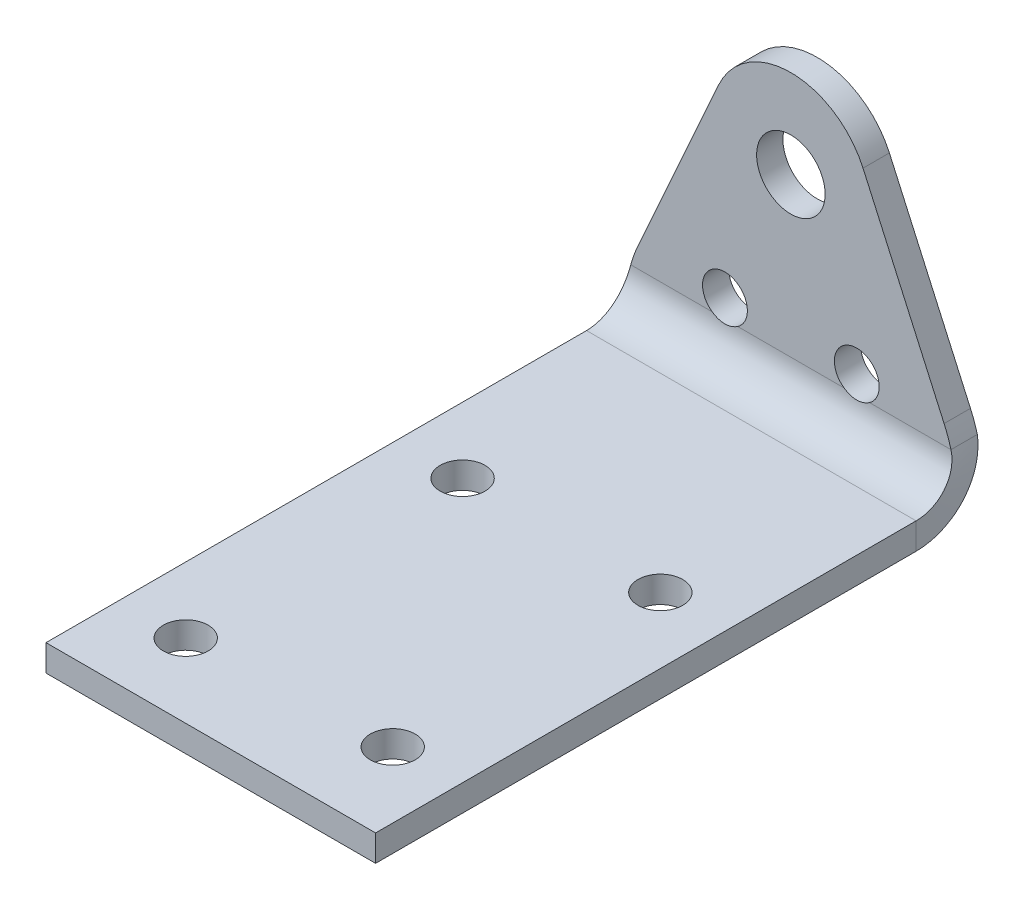
ISO-10303-21;
HEADER;
FILE_DESCRIPTION(('STEP AP214'),'2;1');
FILE_NAME('part.step','',(''),(''),'','','');
FILE_SCHEMA(('AUTOMOTIVE_DESIGN { 1 0 10303 214 1 1 1 1 }'));
ENDSEC;
DATA;
#1=APPLICATION_CONTEXT('core data for automotive mechanical design processes');
#2=APPLICATION_PROTOCOL_DEFINITION('international standard','automotive_design',2000,#1);
#3=PRODUCT_CONTEXT('',#1,'mechanical');
#4=PRODUCT('Part','Part','',(#3));
#5=PRODUCT_RELATED_PRODUCT_CATEGORY('part','',(#4));
#6=PRODUCT_DEFINITION_FORMATION('','',#4);
#7=PRODUCT_DEFINITION_CONTEXT('part definition',#1,'design');
#8=PRODUCT_DEFINITION('design','',#6,#7);
#9=PRODUCT_DEFINITION_SHAPE('','',#8);
#10=(LENGTH_UNIT() NAMED_UNIT(*) SI_UNIT(.MILLI.,.METRE.));
#11=(NAMED_UNIT(*) PLANE_ANGLE_UNIT() SI_UNIT($,.RADIAN.));
#12=(NAMED_UNIT(*) SI_UNIT($,.STERADIAN.) SOLID_ANGLE_UNIT());
#13=UNCERTAINTY_MEASURE_WITH_UNIT(LENGTH_MEASURE(1.E-05),#10,'distance_accuracy_value','');
#14=(GEOMETRIC_REPRESENTATION_CONTEXT(3) GLOBAL_UNCERTAINTY_ASSIGNED_CONTEXT((#13)) GLOBAL_UNIT_ASSIGNED_CONTEXT((#10,
#11,#12)) REPRESENTATION_CONTEXT('',''));
#15=CARTESIAN_POINT('',(0.,0.,0.));
#16=DIRECTION('',(0.,0.,1.));
#17=DIRECTION('',(1.,0.,0.));
#18=AXIS2_PLACEMENT_3D('',#15,#16,#17);
#19=CARTESIAN_POINT('',(2.5,2.35907516703581,-44.));
#20=DIRECTION('',(0.,0.,1.));
#21=DIRECTION('',(1.,0.,0.));
#22=AXIS2_PLACEMENT_3D('',#19,#20,#21);
#23=CYLINDRICAL_SURFACE('',#22,10.);
#24=CARTESIAN_POINT('',(12.1449736146157,5.,-46.));
#25=CARTESIAN_POINT('',(12.1449736146157,5.,-44.));
#26=B_SPLINE_CURVE_WITH_KNOTS('',1,(#24,#25),.UNSPECIFIED.,.F.,.F.,(2,2),(0.,1.),.UNSPECIFIED.);
#27=CARTESIAN_POINT('',(12.1449736146157,5.,-46.));
#28=VERTEX_POINT('',#27);
#29=CARTESIAN_POINT('',(12.1449736146157,5.,-44.));
#30=VERTEX_POINT('',#29);
#31=EDGE_CURVE('E403',#28,#30,#26,.T.);
#32=ORIENTED_EDGE('',*,*,#31,.F.);
#33=CARTESIAN_POINT('',(2.5,2.35907516703581,-46.));
#34=DIRECTION('',(0.,0.,1.));
#35=DIRECTION('',(1.,0.,0.));
#36=AXIS2_PLACEMENT_3D('',#33,#34,#35);
#37=CIRCLE('',#36,10.);
#38=CARTESIAN_POINT('',(11.6234646864046,6.45326521097956,-46.));
#39=VERTEX_POINT('',#38);
#40=EDGE_CURVE('E289',#28,#39,#37,.T.);
#41=ORIENTED_EDGE('',*,*,#40,.T.);
#42=DIRECTION('',(0.,0.,1.));
#43=VECTOR('',#42,1.);
#44=CARTESIAN_POINT('',(11.6234646864046,6.45326521097956,-44.));
#45=LINE('',#44,#43);
#46=CARTESIAN_POINT('',(11.6234646864046,6.45326521097956,-44.));
#47=VERTEX_POINT('',#46);
#48=EDGE_CURVE('E401',#39,#47,#45,.T.);
#49=ORIENTED_EDGE('',*,*,#48,.T.);
#50=CARTESIAN_POINT('',(2.5,2.35907516703581,-44.));
#51=DIRECTION('',(0.,0.,1.));
#52=DIRECTION('',(-1.,0.,0.));
#53=AXIS2_PLACEMENT_3D('',#50,#51,#52);
#54=CIRCLE('',#53,10.);
#55=EDGE_CURVE('E265',#30,#47,#54,.T.);
#56=ORIENTED_EDGE('',*,*,#55,.F.);
#57=EDGE_LOOP('',(#32,#41,#49,#56));
#58=FACE_BOUND('',#57,.T.);
#59=ADVANCED_FACE('F37',(#58),#23,.T.);
#60=CARTESIAN_POINT('',(5.47407881184279,20.1565140263662,-44.));
#61=DIRECTION('',(-0.912346468640461,-0.409419004394374,0.));
#62=DIRECTION('',(-0.409419004394374,0.912346468640461,0.));
#63=AXIS2_PLACEMENT_3D('',#60,#61,#62);
#64=PLANE('',#63);
#65=ORIENTED_EDGE('',*,*,#48,.F.);
#66=DIRECTION('',(-0.409419004394374,0.912346468640461,0.));
#67=VECTOR('',#66,1.);
#68=CARTESIAN_POINT('',(5.47407881184279,20.1565140263662,-46.));
#69=LINE('',#68,#67);
#70=CARTESIAN_POINT('',(5.47407881184279,20.1565140263662,-46.));
#71=VERTEX_POINT('',#70);
#72=EDGE_CURVE('E286',#39,#71,#69,.T.);
#73=ORIENTED_EDGE('',*,*,#72,.T.);
#74=DIRECTION('',(0.,0.,1.));
#75=VECTOR('',#74,1.);
#76=CARTESIAN_POINT('',(5.47407881184279,20.1565140263662,-44.));
#77=LINE('',#76,#75);
#78=CARTESIAN_POINT('',(5.47407881184279,20.1565140263662,-44.));
#79=VERTEX_POINT('',#78);
#80=EDGE_CURVE('E399',#71,#79,#77,.T.);
#81=ORIENTED_EDGE('',*,*,#80,.T.);
#82=DIRECTION('',(-0.409419004394374,0.912346468640461,0.));
#83=VECTOR('',#82,1.);
#84=CARTESIAN_POINT('',(5.47407881184279,20.1565140263662,-44.));
#85=LINE('',#84,#83);
#86=EDGE_CURVE('E261',#47,#79,#85,.T.);
#87=ORIENTED_EDGE('',*,*,#86,.F.);
#88=EDGE_LOOP('',(#65,#73,#81,#87));
#89=FACE_BOUND('',#88,.T.);
#90=ADVANCED_FACE('F435',(#89),#64,.F.);
#91=CARTESIAN_POINT('',(0.,17.7,-44.));
#92=DIRECTION('',(0.,0.,1.));
#93=DIRECTION('',(1.,0.,0.));
#94=AXIS2_PLACEMENT_3D('',#91,#92,#93);
#95=CYLINDRICAL_SURFACE('',#94,6.);
#96=ORIENTED_EDGE('',*,*,#80,.F.);
#97=CARTESIAN_POINT('',(0.,17.7,-46.));
#98=DIRECTION('',(0.,0.,1.));
#99=DIRECTION('',(1.,0.,0.));
#100=AXIS2_PLACEMENT_3D('',#97,#98,#99);
#101=CIRCLE('',#100,6.);
#102=CARTESIAN_POINT('',(-5.47407881184273,20.1565140263663,-46.));
#103=VERTEX_POINT('',#102);
#104=EDGE_CURVE('E283',#71,#103,#101,.T.);
#105=ORIENTED_EDGE('',*,*,#104,.T.);
#106=DIRECTION('',(0.,0.,1.));
#107=VECTOR('',#106,1.);
#108=CARTESIAN_POINT('',(-5.47407881184273,20.1565140263663,-44.));
#109=LINE('',#108,#107);
#110=CARTESIAN_POINT('',(-5.47407881184273,20.1565140263663,-44.));
#111=VERTEX_POINT('',#110);
#112=EDGE_CURVE('E397',#103,#111,#109,.T.);
#113=ORIENTED_EDGE('',*,*,#112,.T.);
#114=CARTESIAN_POINT('',(0.,17.7,-44.));
#115=DIRECTION('',(0.,0.,1.));
#116=DIRECTION('',(-1.,0.,0.));
#117=AXIS2_PLACEMENT_3D('',#114,#115,#116);
#118=CIRCLE('',#117,6.);
#119=EDGE_CURVE('E264',#79,#111,#118,.T.);
#120=ORIENTED_EDGE('',*,*,#119,.F.);
#121=EDGE_LOOP('',(#96,#105,#113,#120));
#122=FACE_BOUND('',#121,.T.);
#123=ADVANCED_FACE('F438',(#122),#95,.T.);
#124=CARTESIAN_POINT('',(-11.6234646864046,6.45326521097959,-44.));
#125=DIRECTION('',(0.912346468640459,-0.409419004394377,0.));
#126=DIRECTION('',(-0.409419004394378,-0.91234646864046,0.));
#127=AXIS2_PLACEMENT_3D('',#124,#125,#126);
#128=PLANE('',#127);
#129=ORIENTED_EDGE('',*,*,#112,.F.);
#130=DIRECTION('',(-0.409419004394378,-0.91234646864046,0.));
#131=VECTOR('',#130,1.);
#132=CARTESIAN_POINT('',(-11.6234646864046,6.45326521097959,-46.));
#133=LINE('',#132,#131);
#134=CARTESIAN_POINT('',(-11.6234646864046,6.45326521097959,-46.));
#135=VERTEX_POINT('',#134);
#136=EDGE_CURVE('E280',#103,#135,#133,.T.);
#137=ORIENTED_EDGE('',*,*,#136,.T.);
#138=DIRECTION('',(0.,0.,1.));
#139=VECTOR('',#138,1.);
#140=CARTESIAN_POINT('',(-11.6234646864046,6.45326521097959,-44.));
#141=LINE('',#140,#139);
#142=CARTESIAN_POINT('',(-11.6234646864046,6.45326521097959,-44.));
#143=VERTEX_POINT('',#142);
#144=EDGE_CURVE('E390',#135,#143,#141,.T.);
#145=ORIENTED_EDGE('',*,*,#144,.T.);
#146=DIRECTION('',(-0.409419004394378,-0.91234646864046,0.));
#147=VECTOR('',#146,1.);
#148=CARTESIAN_POINT('',(-11.6234646864046,6.45326521097959,-44.));
#149=LINE('',#148,#147);
#150=EDGE_CURVE('E268',#111,#143,#149,.T.);
#151=ORIENTED_EDGE('',*,*,#150,.F.);
#152=EDGE_LOOP('',(#129,#137,#145,#151));
#153=FACE_BOUND('',#152,.T.);
#154=ADVANCED_FACE('F441',(#153),#128,.F.);
#155=CARTESIAN_POINT('',(-2.50000000000001,2.35907516703581,-44.));
#156=DIRECTION('',(0.,0.,1.));
#157=DIRECTION('',(1.,0.,0.));
#158=AXIS2_PLACEMENT_3D('',#155,#156,#157);
#159=CYLINDRICAL_SURFACE('',#158,10.);
#160=ORIENTED_EDGE('',*,*,#144,.F.);
#161=CARTESIAN_POINT('',(-2.50000000000001,2.35907516703581,-46.));
#162=DIRECTION('',(0.,0.,1.));
#163=DIRECTION('',(1.,0.,0.));
#164=AXIS2_PLACEMENT_3D('',#161,#162,#163);
#165=CIRCLE('',#164,10.);
#166=CARTESIAN_POINT('',(-12.1449736146157,5.,-46.));
#167=VERTEX_POINT('',#166);
#168=EDGE_CURVE('E176',#135,#167,#165,.T.);
#169=ORIENTED_EDGE('',*,*,#168,.T.);
#170=CARTESIAN_POINT('',(-12.1449736146157,5.,-44.));
#171=CARTESIAN_POINT('',(-12.1449736146157,5.,-46.));
#172=B_SPLINE_CURVE_WITH_KNOTS('',1,(#170,#171),.UNSPECIFIED.,.F.,.F.,(2,2),(0.,1.),.UNSPECIFIED.);
#173=CARTESIAN_POINT('',(-12.1449736146157,5.,-44.));
#174=VERTEX_POINT('',#173);
#175=EDGE_CURVE('E319',#167,#174,#172,.F.);
#176=ORIENTED_EDGE('',*,*,#175,.T.);
#177=CARTESIAN_POINT('',(-2.50000000000001,2.35907516703581,-44.));
#178=DIRECTION('',(0.,0.,1.));
#179=DIRECTION('',(-1.,0.,0.));
#180=AXIS2_PLACEMENT_3D('',#177,#178,#179);
#181=CIRCLE('',#180,10.);
#182=EDGE_CURVE('E459',#143,#174,#181,.T.);
#183=ORIENTED_EDGE('',*,*,#182,.F.);
#184=EDGE_LOOP('',(#160,#169,#176,#183));
#185=FACE_BOUND('',#184,.T.);
#186=ADVANCED_FACE('F344',(#185),#159,.T.);
#187=CARTESIAN_POINT('',(-12.5,0.,-41.));
#188=CARTESIAN_POINT('',(-12.5,0.,-41.590586073631));
#189=CARTESIAN_POINT('',(-12.5012351343653,0.109590480056256,-42.2374966227885));
#190=CARTESIAN_POINT('',(-12.4952300803929,0.482572011709241,-43.1690366897887));
#191=CARTESIAN_POINT('',(-12.4919187698153,0.640733939419891,-43.4728143055767));
#192=CARTESIAN_POINT('',(-12.4810584873086,1.01989145069746,-44.0457752892423));
#193=CARTESIAN_POINT('',(-12.4735095153795,1.24084319388301,-44.3148495161906));
#194=CARTESIAN_POINT('',(-12.4525555006583,1.73276233958689,-44.8006111716858));
#195=CARTESIAN_POINT('',(-12.4391504578663,2.00364122258677,-45.0172190879023));
#196=CARTESIAN_POINT('',(-12.4048658919077,2.57662885241432,-45.3867399517451));
#197=CARTESIAN_POINT('',(-12.3839863687413,2.87862591999868,-45.5396216201994));
#198=CARTESIAN_POINT('',(-12.3077084644133,3.79897644659601,-45.8980722934336));
#199=CARTESIAN_POINT('',(-12.2385358784326,4.43049902154608,-46.));
#200=CARTESIAN_POINT('',(-12.1449736146157,5.,-46.));
#201=CARTESIAN_POINT('',(-12.5,2.,-41.));
#202=CARTESIAN_POINT('',(-12.5,2.,-41.3543516441786));
#203=CARTESIAN_POINT('',(-12.5012351343653,2.06575428803375,-41.7424979736731));
#204=CARTESIAN_POINT('',(-12.4952300803929,2.28954320702554,-42.3014220138732));
#205=CARTESIAN_POINT('',(-12.4919187698153,2.38444036365193,-42.483688583346));
#206=CARTESIAN_POINT('',(-12.4810584873086,2.61193487041848,-42.8274651735454));
#207=CARTESIAN_POINT('',(-12.4735095153795,2.7445059163298,-42.9889097097144));
#208=CARTESIAN_POINT('',(-12.4525555006583,3.03965740375213,-43.2803667030115));
#209=CARTESIAN_POINT('',(-12.4391504578663,3.20218473355206,-43.4103314527414));
#210=CARTESIAN_POINT('',(-12.4048658919077,3.54597731144859,-43.6320439710471));
#211=CARTESIAN_POINT('',(-12.3839863687413,3.72717555199921,-43.7237729721196));
#212=CARTESIAN_POINT('',(-12.3077084644133,4.2793858679576,-43.9388433760602));
#213=CARTESIAN_POINT('',(-12.2385418985836,4.65827742661573,-44.));
#214=CARTESIAN_POINT('',(-12.1449736146157,5.,-44.));
#215=B_SPLINE_SURFACE_WITH_KNOTS('',1,3,((#187,#188,#189,#190,#191,#192,#193,#194,#195,#196,
#197,#198,#199,#200),(#201,#202,#203,#204,#205,#206,#207,#208,#209,#210,#211,#212,#213,#214)),
.UNSPECIFIED.,.F.,.F.,.F.,(2,2),(4,2,2,2,2,2,4),(0.,1.),(0.,0.25,0.375,0.5,0.625,0.75,1.),.UNSPECIFIED.);
#216=CARTESIAN_POINT('',(-12.1449736146157,5.,-46.));
#217=CARTESIAN_POINT('',(-12.2385358784326,4.43049902154608,-46.));
#218=CARTESIAN_POINT('',(-12.3077084644133,3.79897644659601,-45.8980722934336));
#219=CARTESIAN_POINT('',(-12.3839863687413,2.87862591999868,-45.5396216201994));
#220=CARTESIAN_POINT('',(-12.4048658919077,2.57662885241432,-45.3867399517451));
#221=CARTESIAN_POINT('',(-12.4391504578663,2.00364122258677,-45.0172190879023));
#222=CARTESIAN_POINT('',(-12.4525555006583,1.73276233958689,-44.8006111716858));
#223=CARTESIAN_POINT('',(-12.4735095153795,1.24084319388301,-44.3148495161906));
#224=CARTESIAN_POINT('',(-12.4810584873086,1.01989145069746,-44.0457752892423));
#225=CARTESIAN_POINT('',(-12.4919187698153,0.640733939419891,-43.4728143055767));
#226=CARTESIAN_POINT('',(-12.4952300803929,0.482572011709241,-43.1690366897887));
#227=CARTESIAN_POINT('',(-12.5012351343653,0.109590480056256,-42.2374966227885));
#228=CARTESIAN_POINT('',(-12.5,0.,-41.590586073631));
#229=CARTESIAN_POINT('',(-12.5,0.,-41.));
#230=B_SPLINE_CURVE_WITH_KNOTS('',3,(#216,#217,#218,#219,#220,#221,#222,#223,#224,#225,#226,
#227,#228,#229),.UNSPECIFIED.,.F.,.F.,(4,2,2,2,2,2,4),(0.,0.25,0.375,0.5,0.625,0.75,1.),.UNSPECIFIED.);
#231=CARTESIAN_POINT('',(-12.5,0.,-41.));
#232=VERTEX_POINT('',#231);
#233=EDGE_CURVE('E313',#167,#232,#230,.T.);
#234=CARTESIAN_POINT('',(-12.5,0.,-41.));
#235=CARTESIAN_POINT('',(-12.5,2.,-41.));
#236=B_SPLINE_CURVE_WITH_KNOTS('',1,(#234,#235),.UNSPECIFIED.,.F.,.F.,(2,2),(0.,1.),.UNSPECIFIED.);
#237=CARTESIAN_POINT('',(-12.5,2.,-41.));
#238=VERTEX_POINT('',#237);
#239=EDGE_CURVE('E303',#232,#238,#236,.T.);
#240=CARTESIAN_POINT('',(-12.5,2.,-41.));
#241=CARTESIAN_POINT('',(-12.5,2.,-41.3543516441786));
#242=CARTESIAN_POINT('',(-12.5012351343653,2.06575428803375,-41.7424979736731));
#243=CARTESIAN_POINT('',(-12.4952300803929,2.28954320702554,-42.3014220138732));
#244=CARTESIAN_POINT('',(-12.4919187698153,2.38444036365193,-42.483688583346));
#245=CARTESIAN_POINT('',(-12.4810584873086,2.61193487041848,-42.8274651735454));
#246=CARTESIAN_POINT('',(-12.4735095153795,2.7445059163298,-42.9889097097144));
#247=CARTESIAN_POINT('',(-12.4525555006583,3.03965740375213,-43.2803667030115));
#248=CARTESIAN_POINT('',(-12.4391504578663,3.20218473355206,-43.4103314527414));
#249=CARTESIAN_POINT('',(-12.4048658919077,3.54597731144859,-43.6320439710471));
#250=CARTESIAN_POINT('',(-12.3839863687413,3.72717555199921,-43.7237729721196));
#251=CARTESIAN_POINT('',(-12.3077084644133,4.2793858679576,-43.9388433760602));
#252=CARTESIAN_POINT('',(-12.2385418985836,4.65827742661573,-44.));
#253=CARTESIAN_POINT('',(-12.1449736146157,5.,-44.));
#254=B_SPLINE_CURVE_WITH_KNOTS('',3,(#240,#241,#242,#243,#244,#245,#246,#247,#248,#249,#250,
#251,#252,#253),.UNSPECIFIED.,.F.,.F.,(4,2,2,2,2,2,4),(0.,0.25,0.375,0.5,0.625,0.75,1.),.UNSPECIFIED.);
#255=EDGE_CURVE('E460',#174,#238,#254,.F.);
#256=ORIENTED_EDGE('',*,*,#175,.F.);
#257=ORIENTED_EDGE('',*,*,#233,.T.);
#258=ORIENTED_EDGE('',*,*,#239,.T.);
#259=ORIENTED_EDGE('',*,*,#255,.F.);
#260=EDGE_LOOP('',(#256,#257,#258,#259));
#261=FACE_BOUND('',#260,.T.);
#262=ADVANCED_FACE('F315',(#261),#215,.T.);
#263=CARTESIAN_POINT('',(-12.5,2.,-46.));
#264=DIRECTION('',(-1.,0.,0.));
#265=DIRECTION('',(0.,0.,1.));
#266=AXIS2_PLACEMENT_3D('',#263,#264,#265);
#267=PLANE('',#266);
#268=ORIENTED_EDGE('',*,*,#239,.F.);
#269=DIRECTION('',(0.,0.,1.));
#270=VECTOR('',#269,1.);
#271=CARTESIAN_POINT('',(-12.5,0.,0.));
#272=LINE('',#271,#270);
#273=CARTESIAN_POINT('',(-12.5,0.,0.));
#274=VERTEX_POINT('',#273);
#275=EDGE_CURVE('E279',#232,#274,#272,.T.);
#276=ORIENTED_EDGE('',*,*,#275,.T.);
#277=DIRECTION('',(0.,1.,0.));
#278=VECTOR('',#277,1.);
#279=CARTESIAN_POINT('',(-12.5,2.,0.));
#280=LINE('',#279,#278);
#281=CARTESIAN_POINT('',(-12.5,2.,0.));
#282=VERTEX_POINT('',#281);
#283=EDGE_CURVE('E301',#274,#282,#280,.T.);
#284=ORIENTED_EDGE('',*,*,#283,.T.);
#285=DIRECTION('',(0.,0.,1.));
#286=VECTOR('',#285,1.);
#287=CARTESIAN_POINT('',(-12.5,2.,-46.));
#288=LINE('',#287,#286);
#289=EDGE_CURVE('E271',#238,#282,#288,.T.);
#290=ORIENTED_EDGE('',*,*,#289,.F.);
#291=EDGE_LOOP('',(#268,#276,#284,#290));
#292=FACE_BOUND('',#291,.T.);
#293=ADVANCED_FACE('F299',(#292),#267,.T.);
#294=CARTESIAN_POINT('',(-12.5,2.,0.));
#295=DIRECTION('',(0.,0.,1.));
#296=DIRECTION('',(1.,0.,0.));
#297=AXIS2_PLACEMENT_3D('',#294,#295,#296);
#298=PLANE('',#297);
#299=ORIENTED_EDGE('',*,*,#283,.F.);
#300=DIRECTION('',(1.,0.,0.));
#301=VECTOR('',#300,1.);
#302=CARTESIAN_POINT('',(0.,0.,0.));
#303=LINE('',#302,#301);
#304=CARTESIAN_POINT('',(12.5,0.,0.));
#305=VERTEX_POINT('',#304);
#306=EDGE_CURVE('E276',#274,#305,#303,.T.);
#307=ORIENTED_EDGE('',*,*,#306,.T.);
#308=DIRECTION('',(0.,1.,0.));
#309=VECTOR('',#308,1.);
#310=CARTESIAN_POINT('',(12.5,2.,0.));
#311=LINE('',#310,#309);
#312=CARTESIAN_POINT('',(12.5,2.,0.));
#313=VERTEX_POINT('',#312);
#314=EDGE_CURVE('E497',#305,#313,#311,.T.);
#315=ORIENTED_EDGE('',*,*,#314,.T.);
#316=DIRECTION('',(1.,0.,0.));
#317=VECTOR('',#316,1.);
#318=CARTESIAN_POINT('',(-12.5,2.,0.));
#319=LINE('',#318,#317);
#320=EDGE_CURVE('E272',#282,#313,#319,.T.);
#321=ORIENTED_EDGE('',*,*,#320,.F.);
#322=EDGE_LOOP('',(#299,#307,#315,#321));
#323=FACE_BOUND('',#322,.T.);
#324=ADVANCED_FACE('F533',(#323),#298,.T.);
#325=CARTESIAN_POINT('',(12.5,2.,-46.));
#326=DIRECTION('',(1.,0.,0.));
#327=DIRECTION('',(0.,0.,-1.));
#328=AXIS2_PLACEMENT_3D('',#325,#326,#327);
#329=PLANE('',#328);
#330=ORIENTED_EDGE('',*,*,#314,.F.);
#331=DIRECTION('',(0.,0.,1.));
#332=VECTOR('',#331,1.);
#333=CARTESIAN_POINT('',(12.5,0.,0.));
#334=LINE('',#333,#332);
#335=CARTESIAN_POINT('',(12.5,0.,-41.));
#336=VERTEX_POINT('',#335);
#337=EDGE_CURVE('E160',#305,#336,#334,.F.);
#338=ORIENTED_EDGE('',*,*,#337,.T.);
#339=CARTESIAN_POINT('',(12.5,2.,-41.));
#340=CARTESIAN_POINT('',(12.5,0.,-41.));
#341=B_SPLINE_CURVE_WITH_KNOTS('',1,(#339,#340),.UNSPECIFIED.,.F.,.F.,(2,2),(0.,1.),.UNSPECIFIED.);
#342=CARTESIAN_POINT('',(12.5,2.,-41.));
#343=VERTEX_POINT('',#342);
#344=EDGE_CURVE('E503',#336,#343,#341,.F.);
#345=ORIENTED_EDGE('',*,*,#344,.T.);
#346=DIRECTION('',(0.,0.,-1.));
#347=VECTOR('',#346,1.);
#348=CARTESIAN_POINT('',(12.5,2.,-46.));
#349=LINE('',#348,#347);
#350=EDGE_CURVE('E275',#313,#343,#349,.T.);
#351=ORIENTED_EDGE('',*,*,#350,.F.);
#352=EDGE_LOOP('',(#330,#338,#345,#351));
#353=FACE_BOUND('',#352,.T.);
#354=ADVANCED_FACE('F534',(#353),#329,.T.);
#355=CARTESIAN_POINT('',(12.1449736146157,5.,-46.));
#356=CARTESIAN_POINT('',(12.2385358784326,4.43049902154608,-46.));
#357=CARTESIAN_POINT('',(12.3077084644133,3.798976446596,-45.8980722934336));
#358=CARTESIAN_POINT('',(12.3839863687413,2.87862591999867,-45.5396216201994));
#359=CARTESIAN_POINT('',(12.4048658919077,2.57662885241432,-45.3867399517451));
#360=CARTESIAN_POINT('',(12.4391504578663,2.00364122258677,-45.0172190879023));
#361=CARTESIAN_POINT('',(12.4525555006583,1.73276233958689,-44.8006111716858));
#362=CARTESIAN_POINT('',(12.4735095153795,1.24084319388301,-44.3148495161906));
#363=CARTESIAN_POINT('',(12.4810584873086,1.01989145069746,-44.0457752892423));
#364=CARTESIAN_POINT('',(12.4919187698153,0.64073393941989,-43.4728143055767));
#365=CARTESIAN_POINT('',(12.4952300803929,0.482572011709241,-43.1690366897887));
#366=CARTESIAN_POINT('',(12.5012351343653,0.109590480056256,-42.2374966227885));
#367=CARTESIAN_POINT('',(12.5,0.,-41.5905860736311));
#368=CARTESIAN_POINT('',(12.5,0.,-41.));
#369=CARTESIAN_POINT('',(12.1449736146157,5.,-44.));
#370=CARTESIAN_POINT('',(12.2385418985836,4.65827742661573,-44.));
#371=CARTESIAN_POINT('',(12.3077084644133,4.2793858679576,-43.9388433760602));
#372=CARTESIAN_POINT('',(12.3839863687413,3.7271755519992,-43.7237729721196));
#373=CARTESIAN_POINT('',(12.4048658919077,3.54597731144859,-43.6320439710471));
#374=CARTESIAN_POINT('',(12.4391504578663,3.20218473355206,-43.4103314527414));
#375=CARTESIAN_POINT('',(12.4525555006583,3.03965740375213,-43.2803667030115));
#376=CARTESIAN_POINT('',(12.4735095153795,2.7445059163298,-42.9889097097144));
#377=CARTESIAN_POINT('',(12.4810584873086,2.61193487041848,-42.8274651735454));
#378=CARTESIAN_POINT('',(12.4919187698153,2.38444036365193,-42.483688583346));
#379=CARTESIAN_POINT('',(12.4952300803929,2.28954320702554,-42.3014220138732));
#380=CARTESIAN_POINT('',(12.5012351343653,2.06575428803375,-41.7424979736731));
#381=CARTESIAN_POINT('',(12.5,2.,-41.3543516441786));
#382=CARTESIAN_POINT('',(12.5,2.,-41.));
#383=B_SPLINE_SURFACE_WITH_KNOTS('',1,3,((#355,#356,#357,#358,#359,#360,#361,#362,#363,#364,
#365,#366,#367,#368),(#369,#370,#371,#372,#373,#374,#375,#376,#377,#378,#379,#380,#381,#382)),
.UNSPECIFIED.,.F.,.F.,.F.,(2,2),(4,2,2,2,2,2,4),(0.,1.),(0.,0.25,0.375,0.5,0.625,0.75,1.),.UNSPECIFIED.);
#384=CARTESIAN_POINT('',(12.5,0.,-41.));
#385=CARTESIAN_POINT('',(12.5,0.,-41.5905860736311));
#386=CARTESIAN_POINT('',(12.5012351343653,0.109590480056256,-42.2374966227885));
#387=CARTESIAN_POINT('',(12.4952300803929,0.482572011709241,-43.1690366897887));
#388=CARTESIAN_POINT('',(12.4919187698153,0.64073393941989,-43.4728143055767));
#389=CARTESIAN_POINT('',(12.4810584873086,1.01989145069746,-44.0457752892423));
#390=CARTESIAN_POINT('',(12.4735095153795,1.24084319388301,-44.3148495161906));
#391=CARTESIAN_POINT('',(12.4525555006583,1.73276233958689,-44.8006111716858));
#392=CARTESIAN_POINT('',(12.4391504578663,2.00364122258677,-45.0172190879023));
#393=CARTESIAN_POINT('',(12.4048658919077,2.57662885241432,-45.3867399517451));
#394=CARTESIAN_POINT('',(12.3839863687413,2.87862591999867,-45.5396216201994));
#395=CARTESIAN_POINT('',(12.3077084644133,3.798976446596,-45.8980722934336));
#396=CARTESIAN_POINT('',(12.2385358784326,4.43049902154608,-46.));
#397=CARTESIAN_POINT('',(12.1449736146157,5.,-46.));
#398=B_SPLINE_CURVE_WITH_KNOTS('',3,(#384,#385,#386,#387,#388,#389,#390,#391,#392,#393,#394,
#395,#396,#397),.UNSPECIFIED.,.F.,.F.,(4,2,2,2,2,2,4),(0.,0.25,0.375,0.5,0.625,0.75,1.),.UNSPECIFIED.);
#399=EDGE_CURVE('E260',#336,#28,#398,.T.);
#400=CARTESIAN_POINT('',(12.1449736146157,5.,-44.));
#401=CARTESIAN_POINT('',(12.2385418985836,4.65827742661573,-44.));
#402=CARTESIAN_POINT('',(12.3077084644133,4.2793858679576,-43.9388433760602));
#403=CARTESIAN_POINT('',(12.3839863687413,3.7271755519992,-43.7237729721196));
#404=CARTESIAN_POINT('',(12.4048658919077,3.54597731144859,-43.6320439710471));
#405=CARTESIAN_POINT('',(12.4391504578663,3.20218473355206,-43.4103314527414));
#406=CARTESIAN_POINT('',(12.4525555006583,3.03965740375213,-43.2803667030115));
#407=CARTESIAN_POINT('',(12.4735095153795,2.7445059163298,-42.9889097097144));
#408=CARTESIAN_POINT('',(12.4810584873086,2.61193487041848,-42.8274651735454));
#409=CARTESIAN_POINT('',(12.4919187698153,2.38444036365193,-42.483688583346));
#410=CARTESIAN_POINT('',(12.4952300803929,2.28954320702554,-42.3014220138732));
#411=CARTESIAN_POINT('',(12.5012351343653,2.06575428803375,-41.7424979736731));
#412=CARTESIAN_POINT('',(12.5,2.,-41.3543516441786));
#413=CARTESIAN_POINT('',(12.5,2.,-41.));
#414=B_SPLINE_CURVE_WITH_KNOTS('',3,(#400,#401,#402,#403,#404,#405,#406,#407,#408,#409,#410,
#411,#412,#413),.UNSPECIFIED.,.F.,.F.,(4,2,2,2,2,2,4),(0.,0.25,0.375,0.5,0.625,0.75,1.),.UNSPECIFIED.);
#415=EDGE_CURVE('E292',#343,#30,#414,.F.);
#416=ORIENTED_EDGE('',*,*,#399,.T.);
#417=ORIENTED_EDGE('',*,*,#31,.T.);
#418=ORIENTED_EDGE('',*,*,#415,.F.);
#419=ORIENTED_EDGE('',*,*,#344,.F.);
#420=EDGE_LOOP('',(#416,#417,#418,#419));
#421=FACE_BOUND('',#420,.T.);
#422=ADVANCED_FACE('F39',(#421),#383,.T.);
#423=CARTESIAN_POINT('',(0.,2.,0.));
#424=DIRECTION('',(0.,1.,0.));
#425=DIRECTION('',(0.,0.,1.));
#426=AXIS2_PLACEMENT_3D('',#423,#424,#425);
#427=PLANE('',#426);
#428=CARTESIAN_POINT('',(-7.5,2.,-5.6));
#429=DIRECTION('',(0.,1.,0.));
#430=DIRECTION('',(0.,0.,1.));
#431=AXIS2_PLACEMENT_3D('',#428,#429,#430);
#432=CIRCLE('',#431,1.69999999999999);
#433=CARTESIAN_POINT('',(-7.5,2.,-3.90000000000001));
#434=VERTEX_POINT('',#433);
#435=EDGE_CURVE('E233',#434,#434,#432,.T.);
#436=ORIENTED_EDGE('',*,*,#435,.F.);
#437=EDGE_LOOP('',(#436));
#438=FACE_BOUND('',#437,.T.);
#439=CARTESIAN_POINT('',(-7.5,2.,-26.6));
#440=DIRECTION('',(0.,1.,0.));
#441=DIRECTION('',(0.,0.,1.));
#442=AXIS2_PLACEMENT_3D('',#439,#440,#441);
#443=CIRCLE('',#442,1.69999999999999);
#444=CARTESIAN_POINT('',(-7.5,2.,-24.9));
#445=VERTEX_POINT('',#444);
#446=EDGE_CURVE('E239',#445,#445,#443,.T.);
#447=ORIENTED_EDGE('',*,*,#446,.F.);
#448=EDGE_LOOP('',(#447));
#449=FACE_BOUND('',#448,.T.);
#450=CARTESIAN_POINT('',(7.5,2.,-26.6));
#451=DIRECTION('',(0.,1.,0.));
#452=DIRECTION('',(0.,0.,1.));
#453=AXIS2_PLACEMENT_3D('',#450,#451,#452);
#454=CIRCLE('',#453,1.69999999999999);
#455=CARTESIAN_POINT('',(7.5,2.,-24.9));
#456=VERTEX_POINT('',#455);
#457=EDGE_CURVE('E242',#456,#456,#454,.T.);
#458=ORIENTED_EDGE('',*,*,#457,.F.);
#459=EDGE_LOOP('',(#458));
#460=FACE_BOUND('',#459,.T.);
#461=CARTESIAN_POINT('',(7.5,2.,-6.3));
#462=DIRECTION('',(0.,1.,0.));
#463=DIRECTION('',(0.,0.,1.));
#464=AXIS2_PLACEMENT_3D('',#461,#462,#463);
#465=CIRCLE('',#464,1.69999999999999);
#466=CARTESIAN_POINT('',(7.5,2.,-4.60000000000001));
#467=VERTEX_POINT('',#466);
#468=EDGE_CURVE('E248',#467,#467,#465,.T.);
#469=ORIENTED_EDGE('',*,*,#468,.F.);
#470=EDGE_LOOP('',(#469));
#471=FACE_BOUND('',#470,.T.);
#472=ORIENTED_EDGE('',*,*,#350,.T.);
#473=DIRECTION('',(1.,0.,0.));
#474=VECTOR('',#473,1.);
#475=CARTESIAN_POINT('',(0.,2.,-41.));
#476=LINE('',#475,#474);
#477=EDGE_CURVE('E506',#343,#238,#476,.F.);
#478=ORIENTED_EDGE('',*,*,#477,.T.);
#479=ORIENTED_EDGE('',*,*,#289,.T.);
#480=ORIENTED_EDGE('',*,*,#320,.T.);
#481=EDGE_LOOP('',(#472,#478,#479,#480));
#482=FACE_BOUND('',#481,.T.);
#483=ADVANCED_FACE('F207',(#438,#449,#460,#471,#482),#427,.T.);
#484=CARTESIAN_POINT('',(-2.50000000000001,2.35907516703581,-44.));
#485=DIRECTION('',(0.,0.,-1.));
#486=DIRECTION('',(-1.,0.,0.));
#487=AXIS2_PLACEMENT_3D('',#484,#485,#486);
#488=PLANE('',#487);
#489=CARTESIAN_POINT('',(0.,17.,-44.));
#490=DIRECTION('',(0.,0.,-1.));
#491=DIRECTION('',(-1.,0.,0.));
#492=AXIS2_PLACEMENT_3D('',#489,#490,#491);
#493=CIRCLE('',#492,2.6);
#494=CARTESIAN_POINT('',(-2.59999999999998,17.,-44.));
#495=VERTEX_POINT('',#494);
#496=EDGE_CURVE('E257',#495,#495,#493,.F.);
#497=ORIENTED_EDGE('',*,*,#496,.F.);
#498=EDGE_LOOP('',(#497));
#499=FACE_BOUND('',#498,.T.);
#500=DIRECTION('',(1.,0.,0.));
#501=VECTOR('',#500,1.);
#502=CARTESIAN_POINT('',(-2.50000000000001,5.,-44.));
#503=LINE('',#502,#501);
#504=CARTESIAN_POINT('',(-4.03563492390073,5.,-44.));
#505=VERTEX_POINT('',#504);
#506=CARTESIAN_POINT('',(4.03563492390072,5.,-44.));
#507=VERTEX_POINT('',#506);
#508=EDGE_CURVE('E180',#505,#507,#503,.T.);
#509=ORIENTED_EDGE('',*,*,#508,.T.);
#510=CARTESIAN_POINT('',(5.,6.4,-44.));
#511=DIRECTION('',(0.,0.,-1.));
#512=DIRECTION('',(-1.,0.,0.));
#513=AXIS2_PLACEMENT_3D('',#510,#511,#512);
#514=CIRCLE('',#513,1.69999999999999);
#515=CARTESIAN_POINT('',(5.96436507609927,5.,-44.));
#516=VERTEX_POINT('',#515);
#517=EDGE_CURVE('E56',#507,#516,#514,.T.);
#518=ORIENTED_EDGE('',*,*,#517,.T.);
#519=EDGE_CURVE('E44',#516,#30,#503,.T.);
#520=ORIENTED_EDGE('',*,*,#519,.T.);
#521=ORIENTED_EDGE('',*,*,#55,.T.);
#522=ORIENTED_EDGE('',*,*,#86,.T.);
#523=ORIENTED_EDGE('',*,*,#119,.T.);
#524=ORIENTED_EDGE('',*,*,#150,.T.);
#525=ORIENTED_EDGE('',*,*,#182,.T.);
#526=CARTESIAN_POINT('',(-5.96436507609927,5.,-44.));
#527=VERTEX_POINT('',#526);
#528=EDGE_CURVE('E510',#174,#527,#503,.T.);
#529=ORIENTED_EDGE('',*,*,#528,.T.);
#530=CARTESIAN_POINT('',(-5.,6.4,-44.));
#531=DIRECTION('',(0.,0.,-1.));
#532=DIRECTION('',(-1.,0.,0.));
#533=AXIS2_PLACEMENT_3D('',#530,#531,#532);
#534=CIRCLE('',#533,1.69999999999999);
#535=EDGE_CURVE('E229',#527,#505,#534,.T.);
#536=ORIENTED_EDGE('',*,*,#535,.T.);
#537=EDGE_LOOP('',(#509,#518,#520,#521,#522,#523,#524,#525,#529,#536));
#538=FACE_BOUND('',#537,.T.);
#539=ADVANCED_FACE('F205',(#499,#538),#488,.F.);
#540=CARTESIAN_POINT('',(-2.50000000000001,5.,-41.));
#541=DIRECTION('',(1.,0.,0.));
#542=DIRECTION('',(0.,0.,-1.));
#543=AXIS2_PLACEMENT_3D('',#540,#541,#542);
#544=CYLINDRICAL_SURFACE('',#543,3.);
#545=ORIENTED_EDGE('',*,*,#519,.F.);
#546=CARTESIAN_POINT('',(5.96436507609927,5.,-44.));
#547=CARTESIAN_POINT('',(5.92501671129047,4.97289585878519,-43.9999974435491));
#548=CARTESIAN_POINT('',(5.88454658076409,4.94746590351367,-43.9996331777755));
#549=CARTESIAN_POINT('',(5.80162047106657,4.90010447448434,-43.9984302774958));
#550=CARTESIAN_POINT('',(5.75916470091775,4.87817263355766,-43.9975916928173));
#551=CARTESIAN_POINT('',(5.62931141060806,4.81789652204469,-43.9947404120117));
#552=CARTESIAN_POINT('',(5.53931860283916,4.78499653580105,-43.9923908156614));
#553=CARTESIAN_POINT('',(5.35509137444176,4.73475487583047,-43.9883584097372));
#554=CARTESIAN_POINT('',(5.26085558191399,4.71741827275878,-43.9866758175775));
#555=CARTESIAN_POINT('',(5.07080024320211,4.69879621131763,-43.9848561860351));
#556=CARTESIAN_POINT('',(4.97498106763052,4.6975070486525,-43.9847187899693));
#557=CARTESIAN_POINT('',(4.78470646173677,4.71099624256826,-43.9860543302212));
#558=CARTESIAN_POINT('',(4.69024863216011,4.72574156257445,-43.9875239555543));
#559=CARTESIAN_POINT('',(4.50515635930415,4.7708319007699,-43.9913188862279));
#560=CARTESIAN_POINT('',(4.41452022549269,4.8011699414779,-43.9936438087051));
#561=CARTESIAN_POINT('',(4.27599930746714,4.86086727605359,-43.9968518119978));
#562=CARTESIAN_POINT('',(4.22598704455872,4.88540441076703,-43.9979327793653));
#563=CARTESIAN_POINT('',(4.12869006159197,4.93921114612244,-43.9995033667824));
#564=CARTESIAN_POINT('',(4.08140040962492,4.9684717993014,-43.999994090326));
#565=CARTESIAN_POINT('',(4.03563492390072,5.,-44.));
#566=B_SPLINE_CURVE_WITH_KNOTS('',3,(#546,#547,#548,#549,#550,#551,#552,#553,#554,#555,#556,
#557,#558,#559,#560,#561,#562,#563,#564,#565),.UNSPECIFIED.,.F.,.F.,(4,2,2,2,2,2,2,2,2,4),(0.,
0.143246526031812,0.28647800672137,0.572548120016228,0.858711403093286,1.14480862871534,
1.43031751011484,1.71569874216461,1.88260703136455,2.0492027887002),.UNSPECIFIED.);
#567=EDGE_CURVE('E151',#516,#507,#566,.T.);
#568=ORIENTED_EDGE('',*,*,#567,.T.);
#569=ORIENTED_EDGE('',*,*,#508,.F.);
#570=CARTESIAN_POINT('',(-4.03563492390073,5.,-44.));
#571=CARTESIAN_POINT('',(-4.07498328870953,4.97289585878519,-43.9999974435491));
#572=CARTESIAN_POINT('',(-4.1154534192359,4.94746590351367,-43.9996331777755));
#573=CARTESIAN_POINT('',(-4.19837952893343,4.90010447448434,-43.9984302774958));
#574=CARTESIAN_POINT('',(-4.24083529908224,4.87817263355766,-43.9975916928173));
#575=CARTESIAN_POINT('',(-4.37068858939194,4.81789652204469,-43.9947404120117));
#576=CARTESIAN_POINT('',(-4.46068139716084,4.78499653580105,-43.9923908156614));
#577=CARTESIAN_POINT('',(-4.64490862555824,4.73475487583047,-43.9883584097372));
#578=CARTESIAN_POINT('',(-4.739144418086,4.71741827275878,-43.9866758175775));
#579=CARTESIAN_POINT('',(-4.92919975679789,4.69879621131763,-43.9848561860351));
#580=CARTESIAN_POINT('',(-5.02501893236947,4.6975070486525,-43.9847187899693));
#581=CARTESIAN_POINT('',(-5.21529353826323,4.71099624256826,-43.9860543302212));
#582=CARTESIAN_POINT('',(-5.30975136783989,4.72574156257446,-43.9875239555543));
#583=CARTESIAN_POINT('',(-5.49484364069585,4.7708319007699,-43.9913188862279));
#584=CARTESIAN_POINT('',(-5.58547977450731,4.8011699414779,-43.9936438087051));
#585=CARTESIAN_POINT('',(-5.72400069253286,4.86086727605359,-43.9968518119978));
#586=CARTESIAN_POINT('',(-5.77401295544128,4.88540441076703,-43.9979327793653));
#587=CARTESIAN_POINT('',(-5.87130993840803,4.93921114612244,-43.9995033667824));
#588=CARTESIAN_POINT('',(-5.91859959037508,4.9684717993014,-43.999994090326));
#589=CARTESIAN_POINT('',(-5.96436507609928,5.,-44.));
#590=B_SPLINE_CURVE_WITH_KNOTS('',3,(#570,#571,#572,#573,#574,#575,#576,#577,#578,#579,#580,
#581,#582,#583,#584,#585,#586,#587,#588,#589),.UNSPECIFIED.,.F.,.F.,(4,2,2,2,2,2,2,2,2,4),(0.,
0.143246526031812,0.28647800672137,0.572548120016227,0.858711403093285,1.14480862871534,
1.43031751011484,1.71569874216461,1.88260703136455,2.0492027887002),.UNSPECIFIED.);
#591=EDGE_CURVE('E223',#505,#527,#590,.T.);
#592=ORIENTED_EDGE('',*,*,#591,.T.);
#593=ORIENTED_EDGE('',*,*,#528,.F.);
#594=ORIENTED_EDGE('',*,*,#255,.T.);
#595=ORIENTED_EDGE('',*,*,#477,.F.);
#596=ORIENTED_EDGE('',*,*,#415,.T.);
#597=EDGE_LOOP('',(#545,#568,#569,#592,#593,#594,#595,#596));
#598=FACE_BOUND('',#597,.T.);
#599=ADVANCED_FACE('F200',(#598),#544,.F.);
#600=CARTESIAN_POINT('',(0.,0.,0.));
#601=DIRECTION('',(0.,1.,0.));
#602=DIRECTION('',(0.,0.,1.));
#603=AXIS2_PLACEMENT_3D('',#600,#601,#602);
#604=PLANE('',#603);
#605=CARTESIAN_POINT('',(-7.5,0.,-5.6));
#606=DIRECTION('',(0.,1.,0.));
#607=DIRECTION('',(0.,0.,1.));
#608=AXIS2_PLACEMENT_3D('',#605,#606,#607);
#609=CIRCLE('',#608,1.69999999999999);
#610=CARTESIAN_POINT('',(-7.5,0.,-3.90000000000001));
#611=VERTEX_POINT('',#610);
#612=EDGE_CURVE('E236',#611,#611,#609,.T.);
#613=ORIENTED_EDGE('',*,*,#612,.T.);
#614=EDGE_LOOP('',(#613));
#615=FACE_BOUND('',#614,.T.);
#616=CARTESIAN_POINT('',(-7.5,0.,-26.6));
#617=DIRECTION('',(0.,1.,0.));
#618=DIRECTION('',(0.,0.,1.));
#619=AXIS2_PLACEMENT_3D('',#616,#617,#618);
#620=CIRCLE('',#619,1.69999999999999);
#621=CARTESIAN_POINT('',(-7.5,0.,-24.9));
#622=VERTEX_POINT('',#621);
#623=EDGE_CURVE('E165',#622,#622,#620,.T.);
#624=ORIENTED_EDGE('',*,*,#623,.T.);
#625=EDGE_LOOP('',(#624));
#626=FACE_BOUND('',#625,.T.);
#627=CARTESIAN_POINT('',(7.5,0.,-26.6));
#628=DIRECTION('',(0.,1.,0.));
#629=DIRECTION('',(0.,0.,1.));
#630=AXIS2_PLACEMENT_3D('',#627,#628,#629);
#631=CIRCLE('',#630,1.69999999999999);
#632=CARTESIAN_POINT('',(7.5,0.,-24.9));
#633=VERTEX_POINT('',#632);
#634=EDGE_CURVE('E245',#633,#633,#631,.T.);
#635=ORIENTED_EDGE('',*,*,#634,.T.);
#636=EDGE_LOOP('',(#635));
#637=FACE_BOUND('',#636,.T.);
#638=CARTESIAN_POINT('',(7.5,0.,-6.3));
#639=DIRECTION('',(0.,1.,0.));
#640=DIRECTION('',(0.,0.,1.));
#641=AXIS2_PLACEMENT_3D('',#638,#639,#640);
#642=CIRCLE('',#641,1.69999999999999);
#643=CARTESIAN_POINT('',(7.5,0.,-4.60000000000001));
#644=VERTEX_POINT('',#643);
#645=EDGE_CURVE('E251',#644,#644,#642,.T.);
#646=ORIENTED_EDGE('',*,*,#645,.T.);
#647=EDGE_LOOP('',(#646));
#648=FACE_BOUND('',#647,.T.);
#649=ORIENTED_EDGE('',*,*,#337,.F.);
#650=ORIENTED_EDGE('',*,*,#306,.F.);
#651=ORIENTED_EDGE('',*,*,#275,.F.);
#652=DIRECTION('',(1.,0.,0.));
#653=VECTOR('',#652,1.);
#654=CARTESIAN_POINT('',(0.,0.,-41.));
#655=LINE('',#654,#653);
#656=EDGE_CURVE('E158',#336,#232,#655,.F.);
#657=ORIENTED_EDGE('',*,*,#656,.F.);
#658=EDGE_LOOP('',(#649,#650,#651,#657));
#659=FACE_BOUND('',#658,.T.);
#660=ADVANCED_FACE('F204',(#615,#626,#637,#648,#659),#604,.F.);
#661=CARTESIAN_POINT('',(-2.50000000000001,2.35907516703581,-46.));
#662=DIRECTION('',(0.,0.,-1.));
#663=DIRECTION('',(-1.,0.,0.));
#664=AXIS2_PLACEMENT_3D('',#661,#662,#663);
#665=PLANE('',#664);
#666=CARTESIAN_POINT('',(5.,6.4,-46.));
#667=DIRECTION('',(0.,0.,-1.));
#668=DIRECTION('',(-1.,0.,0.));
#669=AXIS2_PLACEMENT_3D('',#666,#667,#668);
#670=CIRCLE('',#669,1.69999999999999);
#671=CARTESIAN_POINT('',(4.03563492390073,5.,-46.));
#672=VERTEX_POINT('',#671);
#673=CARTESIAN_POINT('',(5.96436507609927,5.,-46.));
#674=VERTEX_POINT('',#673);
#675=EDGE_CURVE('E62',#672,#674,#670,.T.);
#676=ORIENTED_EDGE('',*,*,#675,.F.);
#677=DIRECTION('',(-1.,0.,0.));
#678=VECTOR('',#677,1.);
#679=CARTESIAN_POINT('',(-2.50000000000001,5.,-46.));
#680=LINE('',#679,#678);
#681=CARTESIAN_POINT('',(-4.03563492390073,5.,-46.));
#682=VERTEX_POINT('',#681);
#683=EDGE_CURVE('E148',#682,#672,#680,.F.);
#684=ORIENTED_EDGE('',*,*,#683,.F.);
#685=CARTESIAN_POINT('',(-5.,6.4,-46.));
#686=DIRECTION('',(0.,0.,-1.));
#687=DIRECTION('',(-1.,0.,0.));
#688=AXIS2_PLACEMENT_3D('',#685,#686,#687);
#689=CIRCLE('',#688,1.69999999999999);
#690=CARTESIAN_POINT('',(-5.96436507609927,5.,-46.));
#691=VERTEX_POINT('',#690);
#692=EDGE_CURVE('E230',#691,#682,#689,.T.);
#693=ORIENTED_EDGE('',*,*,#692,.F.);
#694=EDGE_CURVE('E156',#167,#691,#680,.F.);
#695=ORIENTED_EDGE('',*,*,#694,.F.);
#696=ORIENTED_EDGE('',*,*,#168,.F.);
#697=ORIENTED_EDGE('',*,*,#136,.F.);
#698=ORIENTED_EDGE('',*,*,#104,.F.);
#699=ORIENTED_EDGE('',*,*,#72,.F.);
#700=ORIENTED_EDGE('',*,*,#40,.F.);
#701=EDGE_CURVE('E150',#674,#28,#680,.F.);
#702=ORIENTED_EDGE('',*,*,#701,.F.);
#703=EDGE_LOOP('',(#676,#684,#693,#695,#696,#697,#698,#699,#700,#702));
#704=FACE_BOUND('',#703,.T.);
#705=CARTESIAN_POINT('',(0.,17.,-46.));
#706=DIRECTION('',(0.,0.,-1.));
#707=DIRECTION('',(-1.,0.,0.));
#708=AXIS2_PLACEMENT_3D('',#705,#706,#707);
#709=CIRCLE('',#708,2.6);
#710=CARTESIAN_POINT('',(-2.59999999999998,17.,-46.));
#711=VERTEX_POINT('',#710);
#712=EDGE_CURVE('E254',#711,#711,#709,.T.);
#713=ORIENTED_EDGE('',*,*,#712,.F.);
#714=EDGE_LOOP('',(#713));
#715=FACE_BOUND('',#714,.T.);
#716=ADVANCED_FACE('F145',(#704,#715),#665,.T.);
#717=CARTESIAN_POINT('',(-2.50000000000001,5.,-41.));
#718=DIRECTION('',(1.,0.,0.));
#719=DIRECTION('',(0.,0.,-1.));
#720=AXIS2_PLACEMENT_3D('',#717,#718,#719);
#721=CYLINDRICAL_SURFACE('',#720,5.);
#722=CARTESIAN_POINT('',(5.96436507609927,5.,-46.));
#723=CARTESIAN_POINT('',(5.92499158859491,4.97287863838694,-45.9999985021034));
#724=CARTESIAN_POINT('',(5.88449336194574,4.94743242186133,-45.999779619603));
#725=CARTESIAN_POINT('',(5.80150378153989,4.90004092595652,-45.9990570939263));
#726=CARTESIAN_POINT('',(5.75901256286803,4.87809540974264,-45.9985534700242));
#727=CARTESIAN_POINT('',(5.62905657058579,4.81779142363052,-45.9968421329919));
#728=CARTESIAN_POINT('',(5.53898904792832,4.78488275085036,-45.9954330437902));
#729=CARTESIAN_POINT('',(5.35461600064853,4.73464929045552,-45.9930178143128));
#730=CARTESIAN_POINT('',(5.26030891042275,4.71733031032809,-45.9920118242774));
#731=CARTESIAN_POINT('',(5.07011692375012,4.69876384432065,-45.9909263185326));
#732=CARTESIAN_POINT('',(4.97423223542872,4.69751425523272,-45.9908466815795));
#733=CARTESIAN_POINT('',(4.78368192906081,4.7111151599477,-45.9916520453597));
#734=CARTESIAN_POINT('',(4.68901568564949,4.72595703181365,-45.9925365295102));
#735=CARTESIAN_POINT('',(4.50353214615089,4.77131364078716,-45.9948186373194));
#736=CARTESIAN_POINT('',(4.41271286290007,4.80182017668366,-45.9962159923562));
#737=CARTESIAN_POINT('',(4.2743894280508,4.86163814646354,-45.998132667307));
#738=CARTESIAN_POINT('',(4.22471901677931,4.88606604138401,-45.9987742185325));
#739=CARTESIAN_POINT('',(4.12807838216067,4.93958972815621,-45.9997058718359));
#740=CARTESIAN_POINT('',(4.08110329279328,4.96867672386102,-45.9999966275424));
#741=CARTESIAN_POINT('',(4.03563492390072,5.,-46.));
#742=B_SPLINE_CURVE_WITH_KNOTS('',3,(#722,#723,#724,#725,#726,#727,#728,#729,#730,#731,#732,
#733,#734,#735,#736,#737,#738,#739,#740,#741),.UNSPECIFIED.,.F.,.F.,(4,2,2,2,2,2,2,2,2,4),(0.,
0.143341287807197,0.286672873955598,0.572903280438235,0.859240269672335,1.14553978191941,
1.43168596831268,1.71768249582079,1.88351215691171,2.04903235217452),.UNSPECIFIED.);
#743=EDGE_CURVE('E11',#674,#672,#742,.T.);
#744=ORIENTED_EDGE('',*,*,#743,.F.);
#745=ORIENTED_EDGE('',*,*,#701,.T.);
#746=ORIENTED_EDGE('',*,*,#399,.F.);
#747=ORIENTED_EDGE('',*,*,#656,.T.);
#748=ORIENTED_EDGE('',*,*,#233,.F.);
#749=ORIENTED_EDGE('',*,*,#694,.T.);
#750=CARTESIAN_POINT('',(-4.03563492390073,5.,-46.));
#751=CARTESIAN_POINT('',(-4.07500841140509,4.97287863838694,-45.9999985021034));
#752=CARTESIAN_POINT('',(-4.11550663805426,4.94743242186133,-45.999779619603));
#753=CARTESIAN_POINT('',(-4.19849621846011,4.90004092595652,-45.9990570939263));
#754=CARTESIAN_POINT('',(-4.24098743713197,4.87809540974264,-45.9985534700242));
#755=CARTESIAN_POINT('',(-4.37094342941421,4.81779142363052,-45.9968421329919));
#756=CARTESIAN_POINT('',(-4.46101095207168,4.78488275085036,-45.9954330437902));
#757=CARTESIAN_POINT('',(-4.64538399935146,4.73464929045552,-45.9930178143128));
#758=CARTESIAN_POINT('',(-4.73969108957725,4.71733031032809,-45.9920118242774));
#759=CARTESIAN_POINT('',(-4.92988307624988,4.69876384432065,-45.9909263185326));
#760=CARTESIAN_POINT('',(-5.02576776457128,4.69751425523272,-45.9908466815795));
#761=CARTESIAN_POINT('',(-5.21631807093918,4.7111151599477,-45.9916520453597));
#762=CARTESIAN_POINT('',(-5.31098431435051,4.72595703181365,-45.9925365295102));
#763=CARTESIAN_POINT('',(-5.49646785384911,4.77131364078716,-45.9948186373194));
#764=CARTESIAN_POINT('',(-5.58728713709993,4.80182017668366,-45.9962159923562));
#765=CARTESIAN_POINT('',(-5.7256105719492,4.86163814646354,-45.998132667307));
#766=CARTESIAN_POINT('',(-5.77528098322069,4.88606604138401,-45.9987742185325));
#767=CARTESIAN_POINT('',(-5.87192161783933,4.93958972815621,-45.9997058718359));
#768=CARTESIAN_POINT('',(-5.91889670720672,4.96867672386102,-45.9999966275424));
#769=CARTESIAN_POINT('',(-5.96436507609927,5.,-46.));
#770=B_SPLINE_CURVE_WITH_KNOTS('',3,(#750,#751,#752,#753,#754,#755,#756,#757,#758,#759,#760,
#761,#762,#763,#764,#765,#766,#767,#768,#769),.UNSPECIFIED.,.F.,.F.,(4,2,2,2,2,2,2,2,2,4),(0.,
0.143341287807198,0.286672873955599,0.572903280438235,0.859240269672335,1.14553978191941,
1.43168596831268,1.71768249582079,1.88351215691171,2.04903235217452),.UNSPECIFIED.);
#771=EDGE_CURVE('E50',#682,#691,#770,.T.);
#772=ORIENTED_EDGE('',*,*,#771,.F.);
#773=ORIENTED_EDGE('',*,*,#683,.T.);
#774=EDGE_LOOP('',(#744,#745,#746,#747,#748,#749,#772,#773));
#775=FACE_BOUND('',#774,.T.);
#776=ADVANCED_FACE('F154',(#775),#721,.T.);
#777=CARTESIAN_POINT('',(0.,17.,0.00102500000000172));
#778=DIRECTION('',(0.,0.,-1.));
#779=DIRECTION('',(-1.,0.,0.));
#780=AXIS2_PLACEMENT_3D('',#777,#778,#779);
#781=CYLINDRICAL_SURFACE('',#780,2.6);
#782=ORIENTED_EDGE('',*,*,#712,.T.);
#783=EDGE_LOOP('',(#782));
#784=FACE_BOUND('',#783,.T.);
#785=ORIENTED_EDGE('',*,*,#496,.T.);
#786=EDGE_LOOP('',(#785));
#787=FACE_BOUND('',#786,.T.);
#788=ADVANCED_FACE('F575',(#784,#787),#781,.F.);
#789=CARTESIAN_POINT('',(7.5,2.,-6.3));
#790=DIRECTION('',(0.,1.,0.));
#791=DIRECTION('',(0.,0.,1.));
#792=AXIS2_PLACEMENT_3D('',#789,#790,#791);
#793=CYLINDRICAL_SURFACE('',#792,1.69999999999999);
#794=ORIENTED_EDGE('',*,*,#468,.T.);
#795=EDGE_LOOP('',(#794));
#796=FACE_BOUND('',#795,.T.);
#797=ORIENTED_EDGE('',*,*,#645,.F.);
#798=EDGE_LOOP('',(#797));
#799=FACE_BOUND('',#798,.T.);
#800=ADVANCED_FACE('F572',(#796,#799),#793,.F.);
#801=CARTESIAN_POINT('',(7.5,2.,-26.6));
#802=DIRECTION('',(0.,1.,0.));
#803=DIRECTION('',(0.,0.,1.));
#804=AXIS2_PLACEMENT_3D('',#801,#802,#803);
#805=CYLINDRICAL_SURFACE('',#804,1.69999999999999);
#806=ORIENTED_EDGE('',*,*,#457,.T.);
#807=EDGE_LOOP('',(#806));
#808=FACE_BOUND('',#807,.T.);
#809=ORIENTED_EDGE('',*,*,#634,.F.);
#810=EDGE_LOOP('',(#809));
#811=FACE_BOUND('',#810,.T.);
#812=ADVANCED_FACE('F574',(#808,#811),#805,.F.);
#813=CARTESIAN_POINT('',(-7.5,2.,-26.6));
#814=DIRECTION('',(0.,1.,0.));
#815=DIRECTION('',(0.,0.,1.));
#816=AXIS2_PLACEMENT_3D('',#813,#814,#815);
#817=CYLINDRICAL_SURFACE('',#816,1.69999999999999);
#818=ORIENTED_EDGE('',*,*,#446,.T.);
#819=EDGE_LOOP('',(#818));
#820=FACE_BOUND('',#819,.T.);
#821=ORIENTED_EDGE('',*,*,#623,.F.);
#822=EDGE_LOOP('',(#821));
#823=FACE_BOUND('',#822,.T.);
#824=ADVANCED_FACE('F582',(#820,#823),#817,.F.);
#825=CARTESIAN_POINT('',(-7.5,2.,-5.6));
#826=DIRECTION('',(0.,1.,0.));
#827=DIRECTION('',(0.,0.,1.));
#828=AXIS2_PLACEMENT_3D('',#825,#826,#827);
#829=CYLINDRICAL_SURFACE('',#828,1.69999999999999);
#830=ORIENTED_EDGE('',*,*,#435,.T.);
#831=EDGE_LOOP('',(#830));
#832=FACE_BOUND('',#831,.T.);
#833=ORIENTED_EDGE('',*,*,#612,.F.);
#834=EDGE_LOOP('',(#833));
#835=FACE_BOUND('',#834,.T.);
#836=ADVANCED_FACE('F609',(#832,#835),#829,.F.);
#837=CARTESIAN_POINT('',(-5.,6.4,-46.));
#838=DIRECTION('',(0.,0.,-1.));
#839=DIRECTION('',(-1.,0.,0.));
#840=AXIS2_PLACEMENT_3D('',#837,#838,#839);
#841=CYLINDRICAL_SURFACE('',#840,1.69999999999999);
#842=ORIENTED_EDGE('',*,*,#771,.T.);
#843=ORIENTED_EDGE('',*,*,#692,.T.);
#844=EDGE_LOOP('',(#842,#843));
#845=FACE_BOUND('',#844,.T.);
#846=ORIENTED_EDGE('',*,*,#591,.F.);
#847=ORIENTED_EDGE('',*,*,#535,.F.);
#848=EDGE_LOOP('',(#846,#847));
#849=FACE_BOUND('',#848,.T.);
#850=ADVANCED_FACE('F190',(#845,#849),#841,.F.);
#851=CARTESIAN_POINT('',(5.,6.4,-46.));
#852=DIRECTION('',(0.,0.,-1.));
#853=DIRECTION('',(-1.,0.,0.));
#854=AXIS2_PLACEMENT_3D('',#851,#852,#853);
#855=CYLINDRICAL_SURFACE('',#854,1.69999999999999);
#856=ORIENTED_EDGE('',*,*,#743,.T.);
#857=ORIENTED_EDGE('',*,*,#675,.T.);
#858=EDGE_LOOP('',(#856,#857));
#859=FACE_BOUND('',#858,.T.);
#860=ORIENTED_EDGE('',*,*,#567,.F.);
#861=ORIENTED_EDGE('',*,*,#517,.F.);
#862=EDGE_LOOP('',(#860,#861));
#863=FACE_BOUND('',#862,.T.);
#864=ADVANCED_FACE('F139',(#859,#863),#855,.F.);
#865=CLOSED_SHELL('',(#59,#90,#123,#154,#186,#262,#293,#324,#354,#422,#483,#539,#599,#660,#716,
#776,#788,#800,#812,#824,#836,#850,#864));
#866=MANIFOLD_SOLID_BREP('B2',#865);
#867=ADVANCED_BREP_SHAPE_REPRESENTATION('',(#18,#866),#14);
#868=SHAPE_DEFINITION_REPRESENTATION(#9,#867);
ENDSEC;
END-ISO-10303-21;
